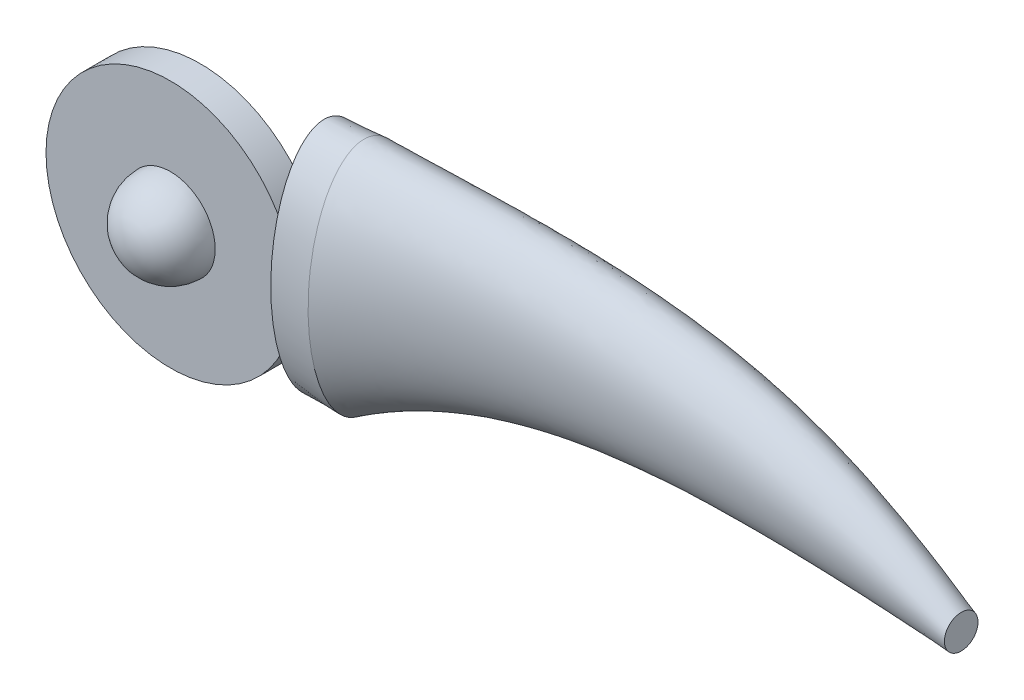
ISO-10303-21;
HEADER;
FILE_DESCRIPTION(('STEP AP214'),'2;1');
FILE_NAME('part.step','',(''),(''),'','','');
FILE_SCHEMA(('AUTOMOTIVE_DESIGN { 1 0 10303 214 1 1 1 1 }'));
ENDSEC;
DATA;
#1=APPLICATION_CONTEXT('core data for automotive mechanical design processes');
#2=APPLICATION_PROTOCOL_DEFINITION('international standard','automotive_design',2000,#1);
#3=PRODUCT_CONTEXT('',#1,'mechanical');
#4=PRODUCT('Part','Part','',(#3));
#5=PRODUCT_RELATED_PRODUCT_CATEGORY('part','',(#4));
#6=PRODUCT_DEFINITION_FORMATION('','',#4);
#7=PRODUCT_DEFINITION_CONTEXT('part definition',#1,'design');
#8=PRODUCT_DEFINITION('design','',#6,#7);
#9=PRODUCT_DEFINITION_SHAPE('','',#8);
#10=(LENGTH_UNIT() NAMED_UNIT(*) SI_UNIT(.MILLI.,.METRE.));
#11=(NAMED_UNIT(*) PLANE_ANGLE_UNIT() SI_UNIT($,.RADIAN.));
#12=(NAMED_UNIT(*) SI_UNIT($,.STERADIAN.) SOLID_ANGLE_UNIT());
#13=UNCERTAINTY_MEASURE_WITH_UNIT(LENGTH_MEASURE(1.E-05),#10,'distance_accuracy_value','');
#14=(GEOMETRIC_REPRESENTATION_CONTEXT(3) GLOBAL_UNCERTAINTY_ASSIGNED_CONTEXT((#13)) GLOBAL_UNIT_ASSIGNED_CONTEXT((#10,
#11,#12)) REPRESENTATION_CONTEXT('',''));
#15=CARTESIAN_POINT('',(0.,0.,0.));
#16=DIRECTION('',(0.,0.,1.));
#17=DIRECTION('',(1.,0.,0.));
#18=AXIS2_PLACEMENT_3D('',#15,#16,#17);
#19=CARTESIAN_POINT('',(-24.31548913251,2.510140874599,-0.0175746787445117));
#20=DIRECTION('',(1.,0.,0.));
#21=DIRECTION('',(0.,0.,-1.));
#22=AXIS2_PLACEMENT_3D('',#19,#20,#21);
#23=PLANE('',#22);
#24=CARTESIAN_POINT('',(-24.31548913251,2.510140874599,-0.0175746787445117));
#25=DIRECTION('',(1.,0.,0.));
#26=DIRECTION('',(0.,0.,-1.));
#27=AXIS2_PLACEMENT_3D('',#24,#25,#26);
#28=CIRCLE('',#27,0.84375);
#29=CARTESIAN_POINT('',(-24.31548913251,2.510140874599,-0.861324678744512));
#30=VERTEX_POINT('',#29);
#31=EDGE_CURVE('E131',#30,#30,#28,.T.);
#32=ORIENTED_EDGE('',*,*,#31,.T.);
#33=EDGE_LOOP('',(#32));
#34=FACE_BOUND('',#33,.T.);
#35=ADVANCED_FACE('F94',(#34),#23,.T.);
#36=CARTESIAN_POINT('',(-24.31548913251,1.67008574184375,0.0613014040154926));
#37=CARTESIAN_POINT('',(-29.321012224999,2.2754058185035,0.314863312304236));
#38=CARTESIAN_POINT('',(-39.2825199940761,2.94043610510664,1.01430502898242));
#39=CARTESIAN_POINT('',(-49.321012225999,2.51636372079201,2.11422391600561));
#40=CARTESIAN_POINT('',(-54.31548913401,2.03152259527652,2.76034230956755));
#41=CARTESIAN_POINT('',(-24.31548913251,1.67226238654371,0.0844833558620206));
#42=CARTESIAN_POINT('',(-29.3188173754686,2.28479408327258,0.354712925939369));
#43=CARTESIAN_POINT('',(-39.2847148518732,2.98363173173974,1.06987615133429));
#44=CARTESIAN_POINT('',(-49.3188173764686,2.63316067520874,2.14669330253932));
#45=CARTESIAN_POINT('',(-54.31548913401,2.19437661678789,2.77248385551378));
#46=CARTESIAN_POINT('',(-24.31548913251,1.67845680789656,0.130234428905743));
#47=CARTESIAN_POINT('',(-29.3147033678555,2.30819400300806,0.433224345937038));
#48=CARTESIAN_POINT('',(-39.2888288749813,3.07725286714101,1.17721175896344));
#49=CARTESIAN_POINT('',(-49.3147033688555,2.86849646547127,2.20662315416814));
#50=CARTESIAN_POINT('',(-54.31548913401,2.51911504733282,2.79031481782358));
#51=CARTESIAN_POINT('',(-24.31548913251,1.69303457580595,0.19682601676993));
#52=CARTESIAN_POINT('',(-29.3093637823588,2.35603071203309,0.545939553030892));
#53=CARTESIAN_POINT('',(-39.2941684805892,3.2366662324548,1.32789932425899));
#54=CARTESIAN_POINT('',(-49.3093637833587,3.22841516542128,2.28024956037844));
#55=CARTESIAN_POINT('',(-54.31548913401,3.0015488322832,2.79830850766432));
#56=CARTESIAN_POINT('',(-24.31548913251,1.71266121961677,0.261186053179322));
#57=CARTESIAN_POINT('',(-29.3045715814813,2.4162209686091,0.653623784218778));
#58=CARTESIAN_POINT('',(-39.298960699516,3.4140645085654,1.46765118574536));
#59=CARTESIAN_POINT('',(-49.3045715824813,3.59277921170085,2.3383031988116));
#60=CARTESIAN_POINT('',(-54.31548913401,3.47754373293301,2.78815307900507));
#61=CARTESIAN_POINT('',(-24.31548913251,1.85929077801821,0.632777784386517));
#62=CARTESIAN_POINT('',(-29.2799655550189,2.84587200582699,1.26733467518771));
#63=CARTESIAN_POINT('',(-39.3235668186551,4.57918837821021,2.24042532715987));
#64=CARTESIAN_POINT('',(-49.2799655560187,5.79649446079972,2.5925106190573));
#65=CARTESIAN_POINT('',(-54.31548913401,6.28428969042715,2.62194760679341));
#66=CARTESIAN_POINT('',(-24.31548913251,2.21810572781455,0.857306769210082));
#67=CARTESIAN_POINT('',(-29.2298808581911,3.82388060066141,1.57122985861323));
#68=CARTESIAN_POINT('',(-39.3736517041225,6.38952287817361,2.40929954953941));
#69=CARTESIAN_POINT('',(-49.229880859191,7.96023940250271,2.13391326007207));
#70=CARTESIAN_POINT('',(-54.31548913401,8.45493513237349,1.64894341445316));
#71=CARTESIAN_POINT('',(-24.31548913251,3.05265599428956,0.778947560011553));
#72=CARTESIAN_POINT('',(-29.1857458268417,5.8077347511515,1.2366537942633));
#73=CARTESIAN_POINT('',(-39.4177869017025,9.85318891144038,1.38050255469452));
#74=CARTESIAN_POINT('',(-49.1857458278418,10.0552085446119,-0.0668149155003753));
#75=CARTESIAN_POINT('',(-54.31548913401,9.38350268223396,-1.11076993345248));
#76=CARTESIAN_POINT('',(-24.31548913251,3.39372890135343,0.367188275426047));
#77=CARTESIAN_POINT('',(-29.2042310035784,6.67485862347233,0.387908442794475));
#78=CARTESIAN_POINT('',(-39.3993016553431,10.5544738365469,0.0293333420394276));
#79=CARTESIAN_POINT('',(-49.2042310045784,9.29784381986884,-1.56645490205022));
#80=CARTESIAN_POINT('',(-54.31548913401,7.15798817270445,-2.55266074813202));
#81=CARTESIAN_POINT('',(-24.31548913251,3.30666311335506,-0.560089798435079));
#82=CARTESIAN_POINT('',(-29.3858556801071,6.31808837462863,-1.14687116884575));
#83=CARTESIAN_POINT('',(-39.2176762947408,8.91585452286183,-2.2601352408837));
#84=CARTESIAN_POINT('',(-49.3858556811071,4.42938549172898,-2.7912290314038));
#85=CARTESIAN_POINT('',(-54.31548913401,0.643827312249324,-3.03832258598112));
#86=CARTESIAN_POINT('',(-24.31548913251,2.89490382876956,-0.901162705498943));
#87=CARTESIAN_POINT('',(-29.5489951798991,5.11057366394081,-1.6584595468054));
#88=CARTESIAN_POINT('',(-39.0545361804979,6.75429247938768,-2.641022601721));
#89=CARTESIAN_POINT('',(-49.5489951808992,1.54378030459511,-2.42499715343299));
#90=CARTESIAN_POINT('',(-54.31548913401,-2.41933062241337,-1.99072758837614));
#91=CARTESIAN_POINT('',(-24.31548913251,2.06035356229454,-0.822803496300413));
#92=CARTESIAN_POINT('',(-29.5279326122876,3.12035322766476,-1.34645303215881));
#93=CARTESIAN_POINT('',(-39.0755988274397,3.25107514921788,-1.58650089815649));
#94=CARTESIAN_POINT('',(-49.5279326132876,-0.465971615201825,-0.253131380504635));
#95=CARTESIAN_POINT('',(-54.31548913401,-3.34789817227384,0.768985759529499));
#96=CARTESIAN_POINT('',(-24.31548913251,1.74960534921292,-0.535406590802408));
#97=CARTESIAN_POINT('',(-29.3990945699592,2.36839906000182,-0.74450539682082));
#98=CARTESIAN_POINT('',(-39.2044373550255,2.40011048737692,-0.555710648149539));
#99=CARTESIAN_POINT('',(-49.3990945709592,-0.0800623778630708,0.951650450066868));
#100=CARTESIAN_POINT('',(-54.31548913401,-1.92224635216948,2.01011110748045));
#101=CARTESIAN_POINT('',(-24.31548913251,1.67470919759962,-0.143014938786108));
#102=CARTESIAN_POINT('',(-29.3441568323391,2.25155916371834,-0.0427841024880392));
#103=CARTESIAN_POINT('',(-39.2593752995639,2.65930446381913,0.500477605674106));
#104=CARTESIAN_POINT('',(-49.3441568333391,1.56045926496789,1.77022516399886));
#105=CARTESIAN_POINT('',(-54.31548913401,0.638017644869082,2.57645283271222));
#106=CARTESIAN_POINT('',(-24.31548913251,1.66740600341983,-0.0761263538955063));
#107=CARTESIAN_POINT('',(-29.3355842187112,2.24496648240491,0.0757024842210995));
#108=CARTESIAN_POINT('',(-39.2679479454797,2.72691628146424,0.674734399793476));
#109=CARTESIAN_POINT('',(-49.3355842197112,1.85602074496533,1.89668055621714));
#110=CARTESIAN_POINT('',(-54.31548913401,1.08404889361484,2.65534971922812));
#111=CARTESIAN_POINT('',(-24.31548913251,1.66547883674919,-0.00798505276236658));
#112=CARTESIAN_POINT('',(-29.3278724650382,2.25194631144597,0.194998893537294));
#113=CARTESIAN_POINT('',(-39.2756597281984,2.81897081831895,0.846572084899352));
#114=CARTESIAN_POINT('',(-49.3278724660382,2.17384218105223,2.01226366506975));
#115=CARTESIAN_POINT('',(-54.31548913401,1.54811836034587,2.71792237225009));
#116=CARTESIAN_POINT('',(-24.31548913251,1.66790909714379,0.0381194521689645));
#117=CARTESIAN_POINT('',(-29.3232070745295,2.26601755373442,0.275013698669102));
#118=CARTESIAN_POINT('',(-39.2803251362789,2.89724047847353,0.958733906630542));
#119=CARTESIAN_POINT('',(-49.3232070755295,2.39956676637529,2.0817545294719));
#120=CARTESIAN_POINT('',(-54.31548913401,1.86866857376514,2.74820076362132));
#121=CARTESIAN_POINT('',(-24.31548913251,1.67008574184375,0.0613014040154926));
#122=CARTESIAN_POINT('',(-29.321012224999,2.2754058185035,0.314863312304236));
#123=CARTESIAN_POINT('',(-39.2825199940761,2.94043610510664,1.01430502898242));
#124=CARTESIAN_POINT('',(-49.321012225999,2.51636372079201,2.11422391600561));
#125=CARTESIAN_POINT('',(-54.31548913401,2.03152259527652,2.76034230956755));
#126=B_SPLINE_SURFACE_WITH_KNOTS('',3,3,((#36,#37,#38,#39,#40),(#41,#42,#43,#44,#45),(#46,#47,
#48,#49,#50),(#51,#52,#53,#54,#55),(#56,#57,#58,#59,#60),(#61,#62,#63,#64,#65),(#66,#67,#68,#69,
#70),(#71,#72,#73,#74,#75),(#76,#77,#78,#79,#80),(#81,#82,#83,#84,#85),(#86,#87,#88,#89,#90),
(#91,#92,#93,#94,#95),(#96,#97,#98,#99,#100),(#101,#102,#103,#104,#105),(#106,#107,#108,#109,
#110),(#111,#112,#113,#114,#115),(#116,#117,#118,#119,#120),(#121,#122,#123,#124,#125)),
.UNSPECIFIED.,.T.,.F.,.F.,(4,1,1,1,1,2,2,2,1,1,1,1,4),(4,1,4),(0.,0.0125,0.0249999999999999,
0.0375000000000001,0.05,0.25,0.5,0.75,0.95,0.9625,0.975,0.9875,1.),(0.,0.500686149248872,1.),.UNSPECIFIED.);
#127=CARTESIAN_POINT('',(-54.31548913401,2.9662151688767,-0.0175746787445117));
#128=DIRECTION('',(1.,0.,0.));
#129=DIRECTION('',(0.,1.,0.));
#130=AXIS2_PLACEMENT_3D('',#127,#128,#129);
#131=ELLIPSE('',#130,5.97497855322229,2.812544073);
#132=CARTESIAN_POINT('',(-54.31548913401,8.941193722099,-0.0175746787445117));
#133=VERTEX_POINT('',#132);
#134=EDGE_CURVE('E148',#133,#133,#131,.F.);
#135=ORIENTED_EDGE('',*,*,#31,.F.);
#136=EDGE_LOOP('',(#135));
#137=FACE_BOUND('',#136,.T.);
#138=ORIENTED_EDGE('',*,*,#134,.F.);
#139=EDGE_LOOP('',(#138));
#140=FACE_BOUND('',#139,.T.);
#141=ADVANCED_FACE('F96',(#137,#140),#126,.T.);
#142=CARTESIAN_POINT('',(-56.31548913401,2.87903913003343,-0.0159769806768288));
#143=DIRECTION('',(-1.,0.,0.));
#144=DIRECTION('',(0.,0.,1.));
#145=AXIS2_PLACEMENT_3D('',#142,#143,#144);
#146=PLANE('',#145);
#147=DIRECTION('',(0.,1.,0.));
#148=VECTOR('',#147,1.);
#149=CARTESIAN_POINT('',(-56.31548913401,2.87903913003343,1.5));
#150=LINE('',#149,#148);
#151=CARTESIAN_POINT('',(-56.31548913401,1.19285338902993,1.5));
#152=VERTEX_POINT('',#151);
#153=CARTESIAN_POINT('',(-56.31548913401,2.57122298975071,1.5));
#154=VERTEX_POINT('',#153);
#155=EDGE_CURVE('E106',#152,#154,#150,.T.);
#156=ORIENTED_EDGE('',*,*,#155,.F.);
#157=DIRECTION('',(0.,0.,-1.));
#158=VECTOR('',#157,1.);
#159=CARTESIAN_POINT('',(-56.31548913401,1.19285338902993,1.5));
#160=LINE('',#159,#158);
#161=CARTESIAN_POINT('',(-56.31548913401,1.19285338902993,0.));
#162=VERTEX_POINT('',#161);
#163=EDGE_CURVE('E120',#152,#162,#160,.T.);
#164=ORIENTED_EDGE('',*,*,#163,.T.);
#165=DIRECTION('',(0.,1.,0.));
#166=VECTOR('',#165,1.);
#167=CARTESIAN_POINT('',(-56.31548913401,2.87903913003343,0.));
#168=LINE('',#167,#166);
#169=CARTESIAN_POINT('',(-56.31548913401,2.57122298975071,0.));
#170=VERTEX_POINT('',#169);
#171=EDGE_CURVE('E127',#162,#170,#168,.T.);
#172=ORIENTED_EDGE('',*,*,#171,.T.);
#173=DIRECTION('',(0.,0.,-1.));
#174=VECTOR('',#173,1.);
#175=CARTESIAN_POINT('',(-56.31548913401,2.57122298975071,1.5));
#176=LINE('',#175,#174);
#177=EDGE_CURVE('E134',#170,#154,#176,.F.);
#178=ORIENTED_EDGE('',*,*,#177,.T.);
#179=EDGE_LOOP('',(#156,#164,#172,#178));
#180=FACE_BOUND('',#179,.T.);
#181=CARTESIAN_POINT('',(-56.31548913401,2.87903913003343,-0.0159769806768288));
#182=DIRECTION('',(-1.,0.,0.));
#183=DIRECTION('',(0.,1.,0.));
#184=AXIS2_PLACEMENT_3D('',#181,#182,#183);
#185=ELLIPSE('',#184,5.93055122416451,2.68552105045264);
#186=CARTESIAN_POINT('',(-56.31548913401,8.80959035419794,-0.0159769806768288));
#187=VERTEX_POINT('',#186);
#188=EDGE_CURVE('E145',#187,#187,#185,.T.);
#189=ORIENTED_EDGE('',*,*,#188,.T.);
#190=EDGE_LOOP('',(#189));
#191=FACE_BOUND('',#190,.T.);
#192=ADVANCED_FACE('F138',(#180,#191),#146,.T.);
#193=CARTESIAN_POINT('',(-56.31548913401,4.06342939945101,2.61544438889344));
#194=CARTESIAN_POINT('',(-54.31548913401,3.27017328095765,2.79132768414632));
#195=CARTESIAN_POINT('',(-56.31548913401,-7.55873176139134,3.68809510220729));
#196=CARTESIAN_POINT('',(-54.31548913401,-8.66431090187431,3.07748622980754));
#197=CARTESIAN_POINT('',(-56.31548913401,-9.92751230022651,-1.57474763693325));
#198=CARTESIAN_POINT('',(-54.31548913401,-9.2722271260362,-2.54031849597412));
#199=CARTESIAN_POINT('',(-56.31548913401,1.69464886061584,-2.6473983502471));
#200=CARTESIAN_POINT('',(-54.31548913401,2.66225705679576,-2.82647704163534));
#201=CARTESIAN_POINT('',(-56.31548913401,13.3168100214582,-3.72004906356095));
#202=CARTESIAN_POINT('',(-54.31548913401,14.5967412396277,-3.11263558729656));
#203=CARTESIAN_POINT('',(-56.31548913401,15.6855905602934,1.54279367557959));
#204=CARTESIAN_POINT('',(-54.31548913401,15.2046574637896,2.5051691384851));
#205=CARTESIAN_POINT('',(-56.31548913401,4.06342939945101,2.61544438889344));
#206=CARTESIAN_POINT('',(-54.31548913401,3.27017328095765,2.79132768414632));
#207=(BOUNDED_SURFACE() B_SPLINE_SURFACE(3,1,((#193,#194),(#195,#196),(#197,#198),(#199,#200),
(#201,#202),(#203,#204),(#205,#206)),.UNSPECIFIED.,.T.,.F.,.F.) B_SPLINE_SURFACE_WITH_KNOTS((4,
3,4),(2,2),(0.,0.5,1.),(0.,1.),
.UNSPECIFIED.) GEOMETRIC_REPRESENTATION_ITEM() RATIONAL_B_SPLINE_SURFACE(((1.,1.),
(0.333333333333333,0.333333333333333),(0.333333333333333,0.333333333333333),(1.,1.),
(0.333333333333333,0.333333333333333),(0.333333333333333,0.333333333333333),(1.,1.))) REPRESENTATION_ITEM('') SURFACE());
#208=ORIENTED_EDGE('',*,*,#188,.F.);
#209=EDGE_LOOP('',(#208));
#210=FACE_BOUND('',#209,.T.);
#211=ORIENTED_EDGE('',*,*,#134,.T.);
#212=EDGE_LOOP('',(#211));
#213=FACE_BOUND('',#212,.T.);
#214=ADVANCED_FACE('F160',(#210,#213),#207,.T.);
#215=CARTESIAN_POINT('',(-62.5273748630743,1.88203818939032,1.5));
#216=DIRECTION('',(0.,0.,-1.));
#217=DIRECTION('',(-1.,0.,0.));
#218=AXIS2_PLACEMENT_3D('',#215,#216,#217);
#219=CYLINDRICAL_SURFACE('',#218,6.25);
#220=ORIENTED_EDGE('',*,*,#177,.F.);
#221=CARTESIAN_POINT('',(-62.5273748630743,1.88203818939032,0.));
#222=DIRECTION('',(0.,0.,1.));
#223=DIRECTION('',(1.,0.,0.));
#224=AXIS2_PLACEMENT_3D('',#221,#222,#223);
#225=CIRCLE('',#224,6.25);
#226=EDGE_CURVE('E113',#170,#162,#225,.T.);
#227=ORIENTED_EDGE('',*,*,#226,.T.);
#228=ORIENTED_EDGE('',*,*,#163,.F.);
#229=CARTESIAN_POINT('',(-62.5273748630743,1.88203818939032,1.5));
#230=DIRECTION('',(0.,0.,1.));
#231=DIRECTION('',(1.,0.,0.));
#232=AXIS2_PLACEMENT_3D('',#229,#230,#231);
#233=CIRCLE('',#232,6.25);
#234=EDGE_CURVE('E135',#154,#152,#233,.T.);
#235=ORIENTED_EDGE('',*,*,#234,.F.);
#236=EDGE_LOOP('',(#220,#227,#228,#235));
#237=FACE_BOUND('',#236,.T.);
#238=ADVANCED_FACE('F133',(#237),#219,.T.);
#239=CARTESIAN_POINT('',(-62.5273748630743,1.88203818939032,1.5));
#240=DIRECTION('',(0.,0.,1.));
#241=DIRECTION('',(1.,0.,0.));
#242=AXIS2_PLACEMENT_3D('',#239,#240,#241);
#243=PLANE('',#242);
#244=CARTESIAN_POINT('',(-62.5273748630743,1.93308328546689,1.5));
#245=DIRECTION('',(0.,0.,1.));
#246=DIRECTION('',(1.,0.,0.));
#247=AXIS2_PLACEMENT_3D('',#244,#245,#246);
#248=CIRCLE('',#247,2.25);
#249=CARTESIAN_POINT('',(-60.2773748630743,1.93308328546689,1.5));
#250=VERTEX_POINT('',#249);
#251=EDGE_CURVE('E13',#250,#250,#248,.T.);
#252=ORIENTED_EDGE('',*,*,#251,.F.);
#253=EDGE_LOOP('',(#252));
#254=FACE_BOUND('',#253,.T.);
#255=ORIENTED_EDGE('',*,*,#234,.T.);
#256=ORIENTED_EDGE('',*,*,#155,.T.);
#257=EDGE_LOOP('',(#255,#256));
#258=FACE_BOUND('',#257,.T.);
#259=ADVANCED_FACE('F144',(#254,#258),#243,.T.);
#260=CARTESIAN_POINT('',(-62.5273748630743,1.88203818939032,0.));
#261=DIRECTION('',(0.,0.,1.));
#262=DIRECTION('',(1.,0.,0.));
#263=AXIS2_PLACEMENT_3D('',#260,#261,#262);
#264=PLANE('',#263);
#265=CARTESIAN_POINT('',(-62.5273748630743,1.93308328546689,0.));
#266=DIRECTION('',(0.,0.,1.));
#267=DIRECTION('',(1.,0.,0.));
#268=AXIS2_PLACEMENT_3D('',#265,#266,#267);
#269=CIRCLE('',#268,1.67705098312484);
#270=CARTESIAN_POINT('',(-60.8503238799494,1.93308328546689,0.));
#271=VERTEX_POINT('',#270);
#272=EDGE_CURVE('E101',#271,#271,#269,.T.);
#273=ORIENTED_EDGE('',*,*,#272,.T.);
#274=EDGE_LOOP('',(#273));
#275=FACE_BOUND('',#274,.T.);
#276=ORIENTED_EDGE('',*,*,#171,.F.);
#277=ORIENTED_EDGE('',*,*,#226,.F.);
#278=EDGE_LOOP('',(#276,#277));
#279=FACE_BOUND('',#278,.T.);
#280=ADVANCED_FACE('F128',(#275,#279),#264,.F.);
#281=CARTESIAN_POINT('',(-62.5273748630743,1.93308328546689,1.5));
#282=DIRECTION('',(1.,0.,0.));
#283=DIRECTION('',(0.,-1.,0.));
#284=AXIS2_PLACEMENT_3D('',#281,#282,#283);
#285=SPHERICAL_SURFACE('',#284,2.25);
#286=CARTESIAN_POINT('',(-62.5273748630743,1.93308328546689,1.5));
#287=DIRECTION('',(0.,0.,1.));
#288=DIRECTION('',(1.,0.,0.));
#289=AXIS2_PLACEMENT_3D('',#286,#287,#288);
#290=SPHERICAL_SURFACE('',#289,2.25);
#291=ORIENTED_EDGE('',*,*,#272,.F.);
#292=EDGE_LOOP('',(#291));
#293=FACE_BOUND('',#292,.T.);
#294=ADVANCED_FACE('F268',(#293),#290,.T.);
#295=CARTESIAN_POINT('',(-62.5273748630743,1.93308328546689,1.5));
#296=DIRECTION('',(0.,0.,1.));
#297=DIRECTION('',(1.,0.,0.));
#298=AXIS2_PLACEMENT_3D('',#295,#296,#297);
#299=SPHERICAL_SURFACE('',#298,2.25);
#300=ORIENTED_EDGE('',*,*,#251,.T.);
#301=EDGE_LOOP('',(#300));
#302=FACE_BOUND('',#301,.T.);
#303=ADVANCED_FACE('F277',(#302),#299,.T.);
#304=CLOSED_SHELL('',(#35,#141,#192,#214,#238,#259,#280,#294,#303));
#305=MANIFOLD_SOLID_BREP('B2',#304);
#306=ADVANCED_BREP_SHAPE_REPRESENTATION('',(#18,#305),#14);
#307=SHAPE_DEFINITION_REPRESENTATION(#9,#306);
ENDSEC;
END-ISO-10303-21;
